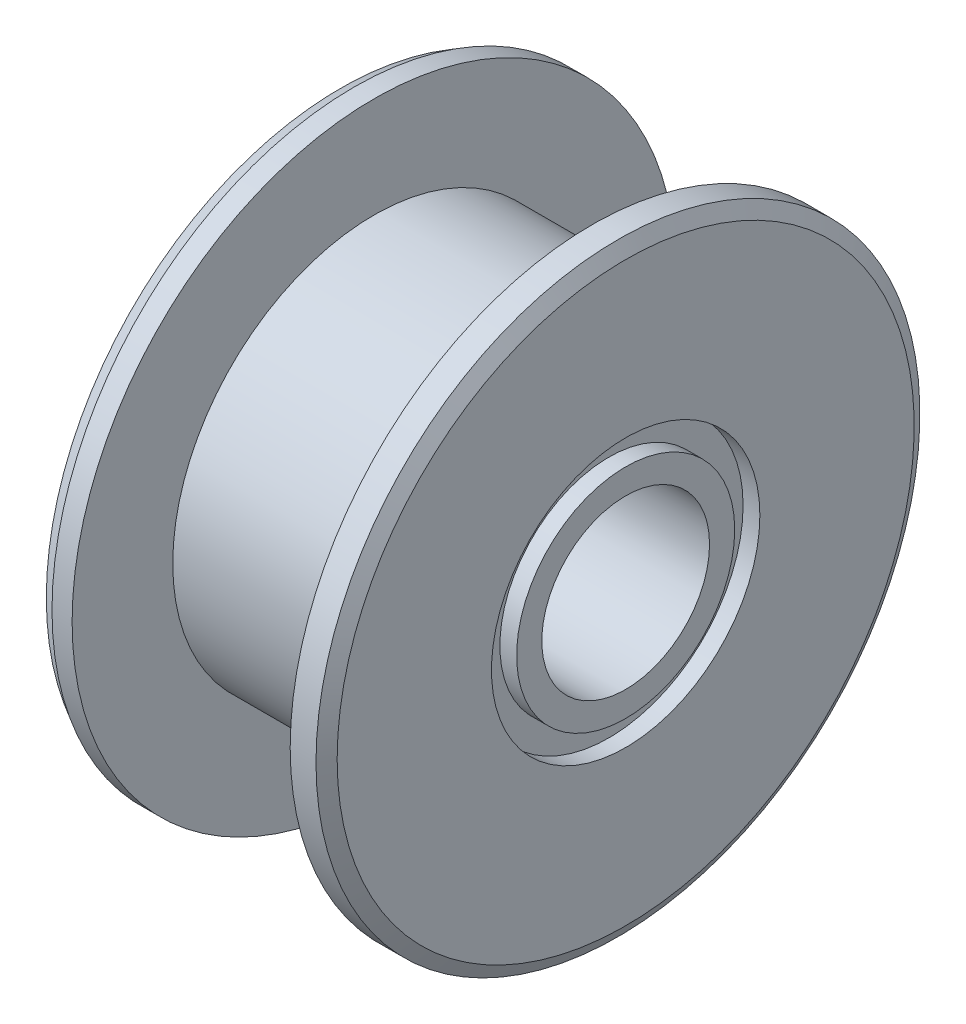
ISO-10303-21;
HEADER;
FILE_DESCRIPTION(('STEP AP214'),'2;1');
FILE_NAME('part.step','',(''),(''),'','','');
FILE_SCHEMA(('AUTOMOTIVE_DESIGN { 1 0 10303 214 1 1 1 1 }'));
ENDSEC;
DATA;
#1=APPLICATION_CONTEXT('core data for automotive mechanical design processes');
#2=APPLICATION_PROTOCOL_DEFINITION('international standard','automotive_design',2000,#1);
#3=PRODUCT_CONTEXT('',#1,'mechanical');
#4=PRODUCT('Part','Part','',(#3));
#5=PRODUCT_RELATED_PRODUCT_CATEGORY('part','',(#4));
#6=PRODUCT_DEFINITION_FORMATION('','',#4);
#7=PRODUCT_DEFINITION_CONTEXT('part definition',#1,'design');
#8=PRODUCT_DEFINITION('design','',#6,#7);
#9=PRODUCT_DEFINITION_SHAPE('','',#8);
#10=(LENGTH_UNIT() NAMED_UNIT(*) SI_UNIT(.MILLI.,.METRE.));
#11=(NAMED_UNIT(*) PLANE_ANGLE_UNIT() SI_UNIT($,.RADIAN.));
#12=(NAMED_UNIT(*) SI_UNIT($,.STERADIAN.) SOLID_ANGLE_UNIT());
#13=UNCERTAINTY_MEASURE_WITH_UNIT(LENGTH_MEASURE(1.E-05),#10,'distance_accuracy_value','');
#14=(GEOMETRIC_REPRESENTATION_CONTEXT(3) GLOBAL_UNCERTAINTY_ASSIGNED_CONTEXT((#13)) GLOBAL_UNIT_ASSIGNED_CONTEXT((#10,
#11,#12)) REPRESENTATION_CONTEXT('',''));
#15=CARTESIAN_POINT('',(0.,0.,0.));
#16=DIRECTION('',(0.,0.,1.));
#17=DIRECTION('',(1.,0.,0.));
#18=AXIS2_PLACEMENT_3D('',#15,#16,#17);
#19=CARTESIAN_POINT('',(0.,0.,0.));
#20=DIRECTION('',(1.,0.,0.));
#21=DIRECTION('',(0.,0.,-1.));
#22=AXIS2_PLACEMENT_3D('',#19,#20,#21);
#23=PLANE('',#22);
#24=CARTESIAN_POINT('',(0.,0.,0.));
#25=DIRECTION('',(1.,0.,0.));
#26=DIRECTION('',(0.,0.,-1.));
#27=AXIS2_PLACEMENT_3D('',#24,#25,#26);
#28=CIRCLE('',#27,2.5);
#29=CARTESIAN_POINT('',(0.,0.,-2.5));
#30=VERTEX_POINT('',#29);
#31=EDGE_CURVE('E62',#30,#30,#28,.T.);
#32=ORIENTED_EDGE('',*,*,#31,.T.);
#33=EDGE_LOOP('',(#32));
#34=FACE_BOUND('',#33,.T.);
#35=CARTESIAN_POINT('',(0.,0.,0.));
#36=DIRECTION('',(-1.,0.,0.));
#37=DIRECTION('',(0.,0.,1.));
#38=AXIS2_PLACEMENT_3D('',#35,#36,#37);
#39=CIRCLE('',#38,3.25);
#40=CARTESIAN_POINT('',(0.,0.,3.25));
#41=VERTEX_POINT('',#40);
#42=EDGE_CURVE('E87',#41,#41,#39,.T.);
#43=ORIENTED_EDGE('',*,*,#42,.T.);
#44=EDGE_LOOP('',(#43));
#45=FACE_BOUND('',#44,.T.);
#46=ADVANCED_FACE('F30',(#34,#45),#23,.F.);
#47=CARTESIAN_POINT('',(8.5,9.,0.));
#48=DIRECTION('',(-1.,0.,0.));
#49=DIRECTION('',(0.,0.,1.));
#50=AXIS2_PLACEMENT_3D('',#47,#48,#49);
#51=PLANE('',#50);
#52=CARTESIAN_POINT('',(8.5,0.,0.));
#53=DIRECTION('',(1.,0.,0.));
#54=DIRECTION('',(0.,0.,-1.));
#55=AXIS2_PLACEMENT_3D('',#52,#53,#54);
#56=CIRCLE('',#55,2.5);
#57=CARTESIAN_POINT('',(8.5,0.,-2.5));
#58=VERTEX_POINT('',#57);
#59=EDGE_CURVE('E63',#58,#58,#56,.T.);
#60=ORIENTED_EDGE('',*,*,#59,.F.);
#61=EDGE_LOOP('',(#60));
#62=FACE_BOUND('',#61,.T.);
#63=CARTESIAN_POINT('',(8.5,0.,0.));
#64=DIRECTION('',(1.,0.,0.));
#65=DIRECTION('',(0.,0.,-1.));
#66=AXIS2_PLACEMENT_3D('',#63,#64,#65);
#67=CIRCLE('',#66,3.25);
#68=CARTESIAN_POINT('',(8.5,0.,-3.25));
#69=VERTEX_POINT('',#68);
#70=EDGE_CURVE('E75',#69,#69,#67,.T.);
#71=ORIENTED_EDGE('',*,*,#70,.T.);
#72=EDGE_LOOP('',(#71));
#73=FACE_BOUND('',#72,.T.);
#74=ADVANCED_FACE('F113',(#62,#73),#51,.F.);
#75=CARTESIAN_POINT('',(0.,0.,0.));
#76=DIRECTION('',(-1.,0.,0.));
#77=DIRECTION('',(0.,0.,1.));
#78=AXIS2_PLACEMENT_3D('',#75,#76,#77);
#79=CIRCLE('',#78,4.);
#80=CARTESIAN_POINT('',(0.,0.,4.));
#81=VERTEX_POINT('',#80);
#82=EDGE_CURVE('E81',#81,#81,#79,.T.);
#83=ORIENTED_EDGE('',*,*,#82,.F.);
#84=EDGE_LOOP('',(#83));
#85=FACE_BOUND('',#84,.T.);
#86=CARTESIAN_POINT('',(0.,0.,0.));
#87=DIRECTION('',(1.,0.,0.));
#88=DIRECTION('',(0.,0.,-1.));
#89=AXIS2_PLACEMENT_3D('',#86,#87,#88);
#90=CIRCLE('',#89,8.76905989232414);
#91=CARTESIAN_POINT('',(0.,0.,-8.76905989232414));
#92=VERTEX_POINT('',#91);
#93=EDGE_CURVE('E45',#92,#92,#90,.F.);
#94=ORIENTED_EDGE('',*,*,#93,.T.);
#95=EDGE_LOOP('',(#94));
#96=FACE_BOUND('',#95,.T.);
#97=ADVANCED_FACE('F109',(#85,#96),#23,.F.);
#98=CARTESIAN_POINT('',(0.,0.,0.));
#99=DIRECTION('',(-1.,0.,0.));
#100=DIRECTION('',(0.,0.,1.));
#101=AXIS2_PLACEMENT_3D('',#98,#99,#100);
#102=CYLINDRICAL_SURFACE('',#101,9.);
#103=CARTESIAN_POINT('',(0.40000000000002,0.,0.));
#104=DIRECTION('',(1.,0.,0.));
#105=DIRECTION('',(0.,0.,-1.));
#106=AXIS2_PLACEMENT_3D('',#103,#104,#105);
#107=CIRCLE('',#106,9.);
#108=CARTESIAN_POINT('',(0.40000000000002,0.,-9.));
#109=VERTEX_POINT('',#108);
#110=EDGE_CURVE('E41',#109,#109,#107,.T.);
#111=ORIENTED_EDGE('',*,*,#110,.T.);
#112=EDGE_LOOP('',(#111));
#113=FACE_BOUND('',#112,.T.);
#114=CARTESIAN_POINT('',(1.,0.,0.));
#115=DIRECTION('',(-1.,0.,0.));
#116=DIRECTION('',(0.,0.,1.));
#117=AXIS2_PLACEMENT_3D('',#114,#115,#116);
#118=CIRCLE('',#117,9.);
#119=CARTESIAN_POINT('',(1.,0.,9.));
#120=VERTEX_POINT('',#119);
#121=EDGE_CURVE('E50',#120,#120,#118,.T.);
#122=ORIENTED_EDGE('',*,*,#121,.T.);
#123=EDGE_LOOP('',(#122));
#124=FACE_BOUND('',#123,.T.);
#125=ADVANCED_FACE('F112',(#113,#124),#102,.T.);
#126=CARTESIAN_POINT('',(1.,9.,0.));
#127=DIRECTION('',(-1.,0.,0.));
#128=DIRECTION('',(0.,0.,1.));
#129=AXIS2_PLACEMENT_3D('',#126,#127,#128);
#130=PLANE('',#129);
#131=ORIENTED_EDGE('',*,*,#121,.F.);
#132=EDGE_LOOP('',(#131));
#133=FACE_BOUND('',#132,.T.);
#134=CARTESIAN_POINT('',(1.,0.,0.));
#135=DIRECTION('',(-1.,0.,0.));
#136=DIRECTION('',(0.,0.,1.));
#137=AXIS2_PLACEMENT_3D('',#134,#135,#136);
#138=CIRCLE('',#137,6.);
#139=CARTESIAN_POINT('',(1.,0.,6.));
#140=VERTEX_POINT('',#139);
#141=EDGE_CURVE('E53',#140,#140,#138,.T.);
#142=ORIENTED_EDGE('',*,*,#141,.T.);
#143=EDGE_LOOP('',(#142));
#144=FACE_BOUND('',#143,.T.);
#145=ADVANCED_FACE('F141',(#133,#144),#130,.F.);
#146=CARTESIAN_POINT('',(0.,0.,0.));
#147=DIRECTION('',(-1.,0.,0.));
#148=DIRECTION('',(0.,0.,1.));
#149=AXIS2_PLACEMENT_3D('',#146,#147,#148);
#150=CYLINDRICAL_SURFACE('',#149,6.);
#151=ORIENTED_EDGE('',*,*,#141,.F.);
#152=EDGE_LOOP('',(#151));
#153=FACE_BOUND('',#152,.T.);
#154=CARTESIAN_POINT('',(7.5,0.,0.));
#155=DIRECTION('',(-1.,0.,0.));
#156=DIRECTION('',(0.,0.,1.));
#157=AXIS2_PLACEMENT_3D('',#154,#155,#156);
#158=CIRCLE('',#157,6.);
#159=CARTESIAN_POINT('',(7.5,0.,6.));
#160=VERTEX_POINT('',#159);
#161=EDGE_CURVE('E56',#160,#160,#158,.T.);
#162=ORIENTED_EDGE('',*,*,#161,.T.);
#163=EDGE_LOOP('',(#162));
#164=FACE_BOUND('',#163,.T.);
#165=ADVANCED_FACE('F145',(#153,#164),#150,.T.);
#166=CARTESIAN_POINT('',(7.5,6.,0.));
#167=DIRECTION('',(1.,0.,0.));
#168=DIRECTION('',(0.,0.,-1.));
#169=AXIS2_PLACEMENT_3D('',#166,#167,#168);
#170=PLANE('',#169);
#171=ORIENTED_EDGE('',*,*,#161,.F.);
#172=EDGE_LOOP('',(#171));
#173=FACE_BOUND('',#172,.T.);
#174=CARTESIAN_POINT('',(7.5,0.,0.));
#175=DIRECTION('',(-1.,0.,0.));
#176=DIRECTION('',(0.,0.,1.));
#177=AXIS2_PLACEMENT_3D('',#174,#175,#176);
#178=CIRCLE('',#177,9.);
#179=CARTESIAN_POINT('',(7.5,0.,9.));
#180=VERTEX_POINT('',#179);
#181=EDGE_CURVE('E59',#180,#180,#178,.T.);
#182=ORIENTED_EDGE('',*,*,#181,.T.);
#183=EDGE_LOOP('',(#182));
#184=FACE_BOUND('',#183,.T.);
#185=ADVANCED_FACE('F149',(#173,#184),#170,.F.);
#186=CARTESIAN_POINT('',(0.,0.,0.));
#187=DIRECTION('',(-1.,0.,0.));
#188=DIRECTION('',(0.,0.,1.));
#189=AXIS2_PLACEMENT_3D('',#186,#187,#188);
#190=CYLINDRICAL_SURFACE('',#189,9.);
#191=CARTESIAN_POINT('',(8.26905989232415,0.,0.));
#192=DIRECTION('',(-1.,0.,0.));
#193=DIRECTION('',(0.,0.,1.));
#194=AXIS2_PLACEMENT_3D('',#191,#192,#193);
#195=CIRCLE('',#194,9.);
#196=CARTESIAN_POINT('',(8.26905989232415,0.,9.));
#197=VERTEX_POINT('',#196);
#198=EDGE_CURVE('E37',#197,#197,#195,.T.);
#199=ORIENTED_EDGE('',*,*,#198,.T.);
#200=EDGE_LOOP('',(#199));
#201=FACE_BOUND('',#200,.T.);
#202=ORIENTED_EDGE('',*,*,#181,.F.);
#203=EDGE_LOOP('',(#202));
#204=FACE_BOUND('',#203,.T.);
#205=ADVANCED_FACE('F127',(#201,#204),#190,.T.);
#206=CARTESIAN_POINT('',(8.5,0.,0.));
#207=DIRECTION('',(1.,0.,0.));
#208=DIRECTION('',(0.,0.,-1.));
#209=AXIS2_PLACEMENT_3D('',#206,#207,#208);
#210=CIRCLE('',#209,4.);
#211=CARTESIAN_POINT('',(8.5,0.,-4.));
#212=VERTEX_POINT('',#211);
#213=EDGE_CURVE('E69',#212,#212,#210,.T.);
#214=ORIENTED_EDGE('',*,*,#213,.F.);
#215=EDGE_LOOP('',(#214));
#216=FACE_BOUND('',#215,.T.);
#217=CARTESIAN_POINT('',(8.5,0.,0.));
#218=DIRECTION('',(-1.,0.,0.));
#219=DIRECTION('',(0.,0.,1.));
#220=AXIS2_PLACEMENT_3D('',#217,#218,#219);
#221=CIRCLE('',#220,8.59999999999999);
#222=CARTESIAN_POINT('',(8.5,0.,8.59999999999999));
#223=VERTEX_POINT('',#222);
#224=EDGE_CURVE('E10',#223,#223,#221,.F.);
#225=ORIENTED_EDGE('',*,*,#224,.T.);
#226=EDGE_LOOP('',(#225));
#227=FACE_BOUND('',#226,.T.);
#228=ADVANCED_FACE('F119',(#216,#227),#51,.F.);
#229=CARTESIAN_POINT('',(0.,0.,0.));
#230=DIRECTION('',(1.,0.,0.));
#231=DIRECTION('',(0.,0.,-1.));
#232=AXIS2_PLACEMENT_3D('',#229,#230,#231);
#233=CONICAL_SURFACE('',#232,8.76905989232414,0.523598775598296);
#234=CARTESIAN_POINT('',(0.40000000000002,0.,-9.));
#235=CARTESIAN_POINT('',(0.395833333333354,0.,-8.99759437387837));
#236=CARTESIAN_POINT('',(0.391666666666687,0.,-8.99518874775675));
#237=CARTESIAN_POINT('',(0.383333333333353,0.,-8.9903774955135));
#238=CARTESIAN_POINT('',(0.379166666666686,0.,-8.98797186939188));
#239=CARTESIAN_POINT('',(0.370833333333352,0.,-8.98316061714863));
#240=CARTESIAN_POINT('',(0.366666666666685,0.,-8.98075499102701));
#241=CARTESIAN_POINT('',(0.358333333333352,0.,-8.97594373878376));
#242=CARTESIAN_POINT('',(0.354166666666684,0.,-8.97353811266214));
#243=CARTESIAN_POINT('',(0.345833333333351,0.,-8.96872686041889));
#244=CARTESIAN_POINT('',(0.341666666666684,0.,-8.96632123429727));
#245=CARTESIAN_POINT('',(0.33333333333335,0.,-8.96150998205402));
#246=CARTESIAN_POINT('',(0.329166666666683,0.,-8.9591043559324));
#247=CARTESIAN_POINT('',(0.32083333333335,0.,-8.95429310368915));
#248=CARTESIAN_POINT('',(0.316666666666683,0.,-8.95188747756753));
#249=CARTESIAN_POINT('',(0.308333333333349,0.,-8.94707622532428));
#250=CARTESIAN_POINT('',(0.304166666666682,0.,-8.94467059920266));
#251=CARTESIAN_POINT('',(0.295833333333348,0.,-8.93985934695941));
#252=CARTESIAN_POINT('',(0.291666666666682,0.,-8.93745372083779));
#253=CARTESIAN_POINT('',(0.283333333333348,0.,-8.93264246859454));
#254=CARTESIAN_POINT('',(0.279166666666681,0.,-8.93023684247292));
#255=CARTESIAN_POINT('',(0.270833333333347,0.,-8.92542559022967));
#256=CARTESIAN_POINT('',(0.26666666666668,0.,-8.92301996410805));
#257=CARTESIAN_POINT('',(0.258333333333346,0.,-8.9182087118648));
#258=CARTESIAN_POINT('',(0.254166666666679,0.,-8.91580308574318));
#259=CARTESIAN_POINT('',(0.245833333333346,0.,-8.91099183349993));
#260=CARTESIAN_POINT('',(0.241666666666679,0.,-8.9085862073783));
#261=CARTESIAN_POINT('',(0.233333333333345,0.,-8.90377495513506));
#262=CARTESIAN_POINT('',(0.229166666666678,0.,-8.90136932901343));
#263=CARTESIAN_POINT('',(0.220833333333345,0.,-8.89655807677019));
#264=CARTESIAN_POINT('',(0.216666666666678,0.,-8.89415245064856));
#265=CARTESIAN_POINT('',(0.208333333333344,0.,-8.88934119840532));
#266=CARTESIAN_POINT('',(0.204166666666677,0.,-8.88693557228369));
#267=CARTESIAN_POINT('',(0.195833333333343,0.,-8.88212432004044));
#268=CARTESIAN_POINT('',(0.191666666666677,0.,-8.87971869391882));
#269=CARTESIAN_POINT('',(0.183333333333343,0.,-8.87490744167557));
#270=CARTESIAN_POINT('',(0.179166666666676,0.,-8.87250181555395));
#271=CARTESIAN_POINT('',(0.170833333333342,0.,-8.8676905633107));
#272=CARTESIAN_POINT('',(0.166666666666675,0.,-8.86528493718908));
#273=CARTESIAN_POINT('',(0.158333333333341,0.,-8.86047368494583));
#274=CARTESIAN_POINT('',(0.154166666666674,0.,-8.85806805882421));
#275=CARTESIAN_POINT('',(0.145833333333341,0.,-8.85325680658096));
#276=CARTESIAN_POINT('',(0.141666666666674,0.,-8.85085118045934));
#277=CARTESIAN_POINT('',(0.13333333333334,0.,-8.84603992821609));
#278=CARTESIAN_POINT('',(0.129166666666673,0.,-8.84363430209447));
#279=CARTESIAN_POINT('',(0.12083333333334,0.,-8.83882304985122));
#280=CARTESIAN_POINT('',(0.116666666666672,0.,-8.8364174237296));
#281=CARTESIAN_POINT('',(0.108333333333339,0.,-8.83160617148635));
#282=CARTESIAN_POINT('',(0.104166666666672,0.,-8.82920054536473));
#283=CARTESIAN_POINT('',(0.0958333333333382,0.,-8.82438929312148));
#284=CARTESIAN_POINT('',(0.0916666666666714,0.,-8.82198366699986));
#285=CARTESIAN_POINT('',(0.0833333333333376,0.,-8.81717241475661));
#286=CARTESIAN_POINT('',(0.0791666666666705,0.,-8.81476678863499));
#287=CARTESIAN_POINT('',(0.0708333333333367,0.,-8.80995553639174));
#288=CARTESIAN_POINT('',(0.0666666666666699,0.,-8.80754991027012));
#289=CARTESIAN_POINT('',(0.0583333333333363,0.,-8.80273865802687));
#290=CARTESIAN_POINT('',(0.0541666666666696,0.,-8.80033303190524));
#291=CARTESIAN_POINT('',(0.0458333333333357,0.,-8.795521779662));
#292=CARTESIAN_POINT('',(0.0416666666666686,0.,-8.79311615354037));
#293=CARTESIAN_POINT('',(0.0333333333333349,0.,-8.78830490129713));
#294=CARTESIAN_POINT('',(0.0291666666666682,0.,-8.7858992751755));
#295=CARTESIAN_POINT('',(0.0208333333333345,0.,-8.78108802293226));
#296=CARTESIAN_POINT('',(0.0166666666666675,0.,-8.77868239681063));
#297=CARTESIAN_POINT('',(0.00833333333333349,0.,-8.77387114456739));
#298=CARTESIAN_POINT('',(0.00416666666666647,0.,-8.77146551844576));
#299=CARTESIAN_POINT('',(0.,0.,-8.76905989232414));
#300=B_SPLINE_CURVE_WITH_KNOTS('',3,(#234,#235,#236,#237,#238,#239,#240,#241,#242,#243,#244,
#245,#246,#247,#248,#249,#250,#251,#252,#253,#254,#255,#256,#257,#258,#259,#260,#261,#262,#263,
#264,#265,#266,#267,#268,#269,#270,#271,#272,#273,#274,#275,#276,#277,#278,#279,#280,#281,#282,
#283,#284,#285,#286,#287,#288,#289,#290,#291,#292,#293,#294,#295,#296,#297,#298,#299),
.UNSPECIFIED.,.F.,.F.,(4,2,2,2,2,2,2,2,2,2,2,2,2,2,2,2,2,2,2,2,2,2,2,2,2,2,2,2,2,2,2,2,4),(0.,
0.0144337567297417,0.0288675134594825,0.0433012701892241,0.0577350269189649,0.0721687836487066,
0.0866025403784483,0.101036297108189,0.115470053837931,0.129903810567672,0.144337567297413,
0.158771324027155,0.173205080756896,0.187638837486637,0.202072594216379,0.21650635094612,
0.230940107675862,0.245373864405603,0.259807621135344,0.274241377865086,0.288675134594826,
0.303108891324568,0.31754264805431,0.33197640478405,0.346410161513792,0.360843918243534,
0.375277674973275,0.389711431703016,0.404145188432758,0.418578945162499,0.43301270189224,
0.447446458621981,0.461880215351723),.UNSPECIFIED.);
#301=EDGE_CURVE('BSEAM117',#109,#92,#300,.T.);
#302=ORIENTED_EDGE('',*,*,#110,.F.);
#303=ORIENTED_EDGE('',*,*,#93,.F.);
#304=ORIENTED_EDGE('',*,*,#301,.T.);
#305=ORIENTED_EDGE('',*,*,#301,.F.);
#306=EDGE_LOOP('',(#302,#304,#303,#305));
#307=FACE_BOUND('',#306,.T.);
#308=ADVANCED_FACE('F117',(#307),#233,.T.);
#309=CARTESIAN_POINT('',(8.26905989232415,0.,0.));
#310=DIRECTION('',(-1.,0.,0.));
#311=DIRECTION('',(0.,0.,1.));
#312=AXIS2_PLACEMENT_3D('',#309,#310,#311);
#313=CONICAL_SURFACE('',#312,9.,1.0471975511966);
#314=ORIENTED_EDGE('',*,*,#224,.F.);
#315=EDGE_LOOP('',(#314));
#316=FACE_BOUND('',#315,.T.);
#317=ORIENTED_EDGE('',*,*,#198,.F.);
#318=EDGE_LOOP('',(#317));
#319=FACE_BOUND('',#318,.T.);
#320=ADVANCED_FACE('F32',(#316,#319),#313,.T.);
#321=CARTESIAN_POINT('',(0.,0.,0.));
#322=DIRECTION('',(1.,0.,0.));
#323=DIRECTION('',(0.,0.,-1.));
#324=AXIS2_PLACEMENT_3D('',#321,#322,#323);
#325=CYLINDRICAL_SURFACE('',#324,2.5);
#326=ORIENTED_EDGE('',*,*,#31,.F.);
#327=EDGE_LOOP('',(#326));
#328=FACE_BOUND('',#327,.T.);
#329=ORIENTED_EDGE('',*,*,#59,.T.);
#330=EDGE_LOOP('',(#329));
#331=FACE_BOUND('',#330,.T.);
#332=ADVANCED_FACE('F125',(#328,#331),#325,.F.);
#333=CARTESIAN_POINT('',(8.,0.,0.));
#334=DIRECTION('',(1.,0.,0.));
#335=DIRECTION('',(0.,0.,-1.));
#336=AXIS2_PLACEMENT_3D('',#333,#334,#335);
#337=CYLINDRICAL_SURFACE('',#336,4.);
#338=CARTESIAN_POINT('',(8.,0.,0.));
#339=DIRECTION('',(1.,0.,0.));
#340=DIRECTION('',(0.,0.,-1.));
#341=AXIS2_PLACEMENT_3D('',#338,#339,#340);
#342=CIRCLE('',#341,4.);
#343=CARTESIAN_POINT('',(8.,0.,-4.));
#344=VERTEX_POINT('',#343);
#345=EDGE_CURVE('E66',#344,#344,#342,.T.);
#346=ORIENTED_EDGE('',*,*,#345,.F.);
#347=EDGE_LOOP('',(#346));
#348=FACE_BOUND('',#347,.T.);
#349=ORIENTED_EDGE('',*,*,#213,.T.);
#350=EDGE_LOOP('',(#349));
#351=FACE_BOUND('',#350,.T.);
#352=ADVANCED_FACE('F158',(#348,#351),#337,.F.);
#353=CARTESIAN_POINT('',(8.,0.,0.));
#354=DIRECTION('',(1.,0.,0.));
#355=DIRECTION('',(0.,0.,-1.));
#356=AXIS2_PLACEMENT_3D('',#353,#354,#355);
#357=PLANE('',#356);
#358=CARTESIAN_POINT('',(8.,0.,0.));
#359=DIRECTION('',(1.,0.,0.));
#360=DIRECTION('',(0.,0.,-1.));
#361=AXIS2_PLACEMENT_3D('',#358,#359,#360);
#362=CIRCLE('',#361,3.25);
#363=CARTESIAN_POINT('',(8.,0.,-3.25));
#364=VERTEX_POINT('',#363);
#365=EDGE_CURVE('E72',#364,#364,#362,.T.);
#366=ORIENTED_EDGE('',*,*,#365,.F.);
#367=EDGE_LOOP('',(#366));
#368=FACE_BOUND('',#367,.T.);
#369=ORIENTED_EDGE('',*,*,#345,.T.);
#370=EDGE_LOOP('',(#369));
#371=FACE_BOUND('',#370,.T.);
#372=ADVANCED_FACE('F162',(#368,#371),#357,.T.);
#373=CARTESIAN_POINT('',(8.,0.,0.));
#374=DIRECTION('',(1.,0.,0.));
#375=DIRECTION('',(0.,0.,-1.));
#376=AXIS2_PLACEMENT_3D('',#373,#374,#375);
#377=CYLINDRICAL_SURFACE('',#376,3.25);
#378=ORIENTED_EDGE('',*,*,#365,.T.);
#379=EDGE_LOOP('',(#378));
#380=FACE_BOUND('',#379,.T.);
#381=ORIENTED_EDGE('',*,*,#70,.F.);
#382=EDGE_LOOP('',(#381));
#383=FACE_BOUND('',#382,.T.);
#384=ADVANCED_FACE('F105',(#380,#383),#377,.T.);
#385=CARTESIAN_POINT('',(0.5,0.,0.));
#386=DIRECTION('',(-1.,0.,0.));
#387=DIRECTION('',(0.,0.,1.));
#388=AXIS2_PLACEMENT_3D('',#385,#386,#387);
#389=CYLINDRICAL_SURFACE('',#388,4.);
#390=CARTESIAN_POINT('',(0.5,0.,0.));
#391=DIRECTION('',(-1.,0.,0.));
#392=DIRECTION('',(0.,0.,1.));
#393=AXIS2_PLACEMENT_3D('',#390,#391,#392);
#394=CIRCLE('',#393,4.);
#395=CARTESIAN_POINT('',(0.5,0.,4.));
#396=VERTEX_POINT('',#395);
#397=EDGE_CURVE('E78',#396,#396,#394,.T.);
#398=ORIENTED_EDGE('',*,*,#397,.F.);
#399=EDGE_LOOP('',(#398));
#400=FACE_BOUND('',#399,.T.);
#401=ORIENTED_EDGE('',*,*,#82,.T.);
#402=EDGE_LOOP('',(#401));
#403=FACE_BOUND('',#402,.T.);
#404=ADVANCED_FACE('F99',(#400,#403),#389,.F.);
#405=CARTESIAN_POINT('',(0.5,0.,0.));
#406=DIRECTION('',(-1.,0.,0.));
#407=DIRECTION('',(0.,0.,1.));
#408=AXIS2_PLACEMENT_3D('',#405,#406,#407);
#409=PLANE('',#408);
#410=CARTESIAN_POINT('',(0.5,0.,0.));
#411=DIRECTION('',(-1.,0.,0.));
#412=DIRECTION('',(0.,0.,1.));
#413=AXIS2_PLACEMENT_3D('',#410,#411,#412);
#414=CIRCLE('',#413,3.25);
#415=CARTESIAN_POINT('',(0.5,0.,3.25));
#416=VERTEX_POINT('',#415);
#417=EDGE_CURVE('E84',#416,#416,#414,.T.);
#418=ORIENTED_EDGE('',*,*,#417,.F.);
#419=EDGE_LOOP('',(#418));
#420=FACE_BOUND('',#419,.T.);
#421=ORIENTED_EDGE('',*,*,#397,.T.);
#422=EDGE_LOOP('',(#421));
#423=FACE_BOUND('',#422,.T.);
#424=ADVANCED_FACE('F96',(#420,#423),#409,.T.);
#425=CARTESIAN_POINT('',(0.5,0.,0.));
#426=DIRECTION('',(-1.,0.,0.));
#427=DIRECTION('',(0.,0.,1.));
#428=AXIS2_PLACEMENT_3D('',#425,#426,#427);
#429=CYLINDRICAL_SURFACE('',#428,3.25);
#430=ORIENTED_EDGE('',*,*,#417,.T.);
#431=EDGE_LOOP('',(#430));
#432=FACE_BOUND('',#431,.T.);
#433=ORIENTED_EDGE('',*,*,#42,.F.);
#434=EDGE_LOOP('',(#433));
#435=FACE_BOUND('',#434,.T.);
#436=ADVANCED_FACE('F93',(#432,#435),#429,.T.);
#437=CLOSED_SHELL('',(#46,#74,#97,#125,#145,#165,#185,#205,#228,#308,#320,#332,#352,#372,#384,
#404,#424,#436));
#438=MANIFOLD_SOLID_BREP('B2',#437);
#439=ADVANCED_BREP_SHAPE_REPRESENTATION('',(#18,#438),#14);
#440=SHAPE_DEFINITION_REPRESENTATION(#9,#439);
ENDSEC;
END-ISO-10303-21;
